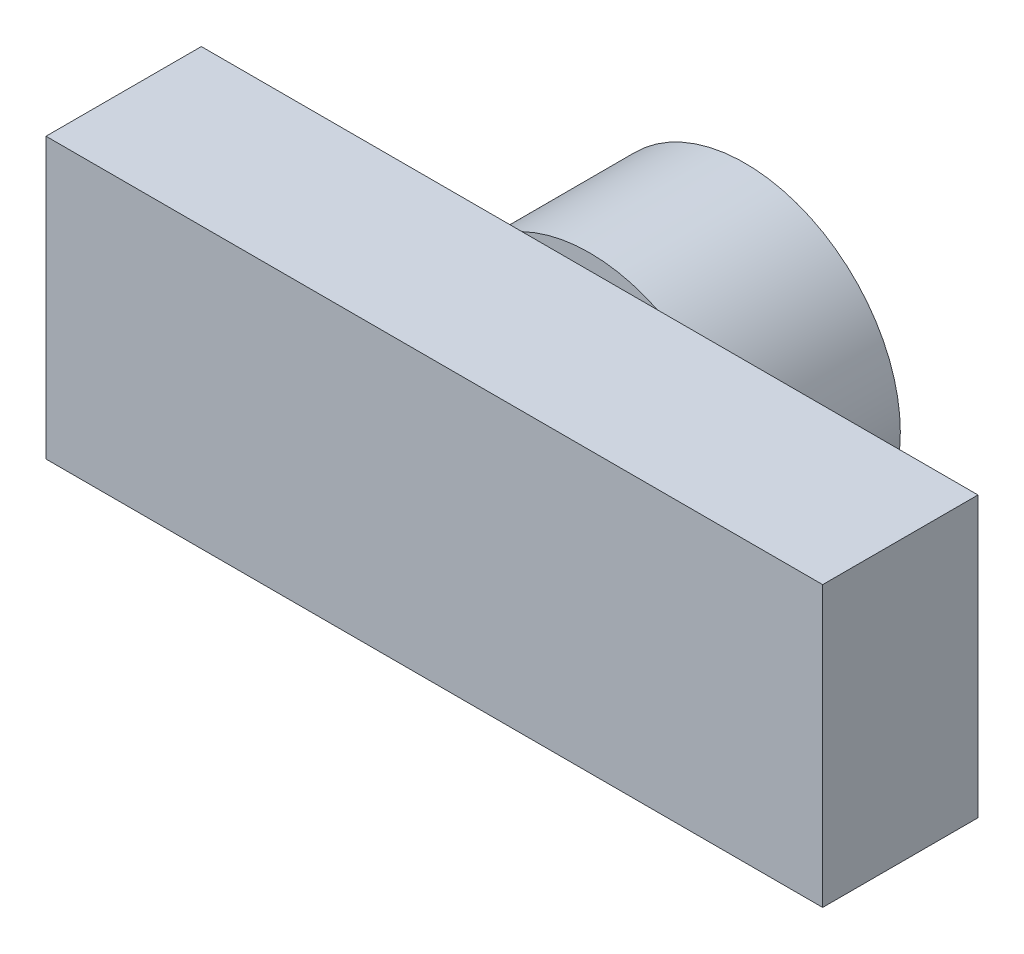
ISO-10303-21;
HEADER;
FILE_DESCRIPTION(('STEP AP214'),'2;1');
FILE_NAME('part.step','',(''),(''),'','','');
FILE_SCHEMA(('AUTOMOTIVE_DESIGN { 1 0 10303 214 1 1 1 1 }'));
ENDSEC;
DATA;
#1=APPLICATION_CONTEXT('core data for automotive mechanical design processes');
#2=APPLICATION_PROTOCOL_DEFINITION('international standard','automotive_design',2000,#1);
#3=PRODUCT_CONTEXT('',#1,'mechanical');
#4=PRODUCT('Part','Part','',(#3));
#5=PRODUCT_RELATED_PRODUCT_CATEGORY('part','',(#4));
#6=PRODUCT_DEFINITION_FORMATION('','',#4);
#7=PRODUCT_DEFINITION_CONTEXT('part definition',#1,'design');
#8=PRODUCT_DEFINITION('design','',#6,#7);
#9=PRODUCT_DEFINITION_SHAPE('','',#8);
#10=(LENGTH_UNIT() NAMED_UNIT(*) SI_UNIT(.MILLI.,.METRE.));
#11=(NAMED_UNIT(*) PLANE_ANGLE_UNIT() SI_UNIT($,.RADIAN.));
#12=(NAMED_UNIT(*) SI_UNIT($,.STERADIAN.) SOLID_ANGLE_UNIT());
#13=UNCERTAINTY_MEASURE_WITH_UNIT(LENGTH_MEASURE(1.E-05),#10,'distance_accuracy_value','');
#14=(GEOMETRIC_REPRESENTATION_CONTEXT(3) GLOBAL_UNCERTAINTY_ASSIGNED_CONTEXT((#13)) GLOBAL_UNIT_ASSIGNED_CONTEXT((#10,
#11,#12)) REPRESENTATION_CONTEXT('',''));
#15=CARTESIAN_POINT('',(0.,0.,0.));
#16=DIRECTION('',(0.,0.,1.));
#17=DIRECTION('',(1.,0.,0.));
#18=AXIS2_PLACEMENT_3D('',#15,#16,#17);
#19=CARTESIAN_POINT('',(0.,0.,5.));
#20=DIRECTION('',(0.,0.,1.));
#21=DIRECTION('',(1.,0.,0.));
#22=AXIS2_PLACEMENT_3D('',#19,#20,#21);
#23=PLANE('',#22);
#24=DIRECTION('',(1.,0.,0.));
#25=VECTOR('',#24,1.);
#26=CARTESIAN_POINT('',(-12.5,-4.5,5.));
#27=LINE('',#26,#25);
#28=CARTESIAN_POINT('',(-2.17944947177034,-4.5,5.));
#29=VERTEX_POINT('',#28);
#30=CARTESIAN_POINT('',(2.17944947177034,-4.5,5.));
#31=VERTEX_POINT('',#30);
#32=EDGE_CURVE('E11',#29,#31,#27,.T.);
#33=ORIENTED_EDGE('',*,*,#32,.F.);
#34=CARTESIAN_POINT('',(0.,0.,5.));
#35=DIRECTION('',(0.,0.,1.));
#36=DIRECTION('',(1.,0.,0.));
#37=AXIS2_PLACEMENT_3D('',#34,#35,#36);
#38=CIRCLE('',#37,5.);
#39=EDGE_CURVE('E143',#29,#31,#38,.T.);
#40=ORIENTED_EDGE('',*,*,#39,.T.);
#41=EDGE_LOOP('',(#33,#40));
#42=FACE_BOUND('',#41,.T.);
#43=ADVANCED_FACE('F39',(#42),#23,.T.);
#44=CARTESIAN_POINT('',(0.,0.,5.));
#45=DIRECTION('',(0.,0.,-1.));
#46=DIRECTION('',(-1.,0.,0.));
#47=AXIS2_PLACEMENT_3D('',#44,#45,#46);
#48=CYLINDRICAL_SURFACE('',#47,5.);
#49=CARTESIAN_POINT('',(2.17944947177034,4.5,5.));
#50=VERTEX_POINT('',#49);
#51=CARTESIAN_POINT('',(-2.17944947177034,4.5,5.));
#52=VERTEX_POINT('',#51);
#53=EDGE_CURVE('E131',#50,#52,#38,.T.);
#54=ORIENTED_EDGE('',*,*,#53,.F.);
#55=EDGE_CURVE('E59',#31,#50,#38,.T.);
#56=ORIENTED_EDGE('',*,*,#55,.F.);
#57=ORIENTED_EDGE('',*,*,#39,.F.);
#58=EDGE_CURVE('E133',#52,#29,#38,.T.);
#59=ORIENTED_EDGE('',*,*,#58,.F.);
#60=EDGE_LOOP('',(#54,#56,#57,#59));
#61=FACE_BOUND('',#60,.T.);
#62=CARTESIAN_POINT('',(0.,0.,0.));
#63=DIRECTION('',(0.,0.,1.));
#64=DIRECTION('',(1.,0.,0.));
#65=AXIS2_PLACEMENT_3D('',#62,#63,#64);
#66=CIRCLE('',#65,5.);
#67=CARTESIAN_POINT('',(5.,0.,0.));
#68=VERTEX_POINT('',#67);
#69=EDGE_CURVE('E43',#68,#68,#66,.T.);
#70=ORIENTED_EDGE('',*,*,#69,.T.);
#71=EDGE_LOOP('',(#70));
#72=FACE_BOUND('',#71,.T.);
#73=ADVANCED_FACE('F41',(#61,#72),#48,.T.);
#74=DIRECTION('',(-1.,0.,0.));
#75=VECTOR('',#74,1.);
#76=CARTESIAN_POINT('',(-12.5,4.5,5.));
#77=LINE('',#76,#75);
#78=EDGE_CURVE('E49',#50,#52,#77,.T.);
#79=ORIENTED_EDGE('',*,*,#78,.F.);
#80=ORIENTED_EDGE('',*,*,#53,.T.);
#81=EDGE_LOOP('',(#79,#80));
#82=FACE_BOUND('',#81,.T.);
#83=ADVANCED_FACE('F186',(#82),#23,.T.);
#84=CARTESIAN_POINT('',(0.,0.,0.));
#85=DIRECTION('',(0.,0.,1.));
#86=DIRECTION('',(1.,0.,0.));
#87=AXIS2_PLACEMENT_3D('',#84,#85,#86);
#88=PLANE('',#87);
#89=ORIENTED_EDGE('',*,*,#69,.F.);
#90=EDGE_LOOP('',(#89));
#91=FACE_BOUND('',#90,.T.);
#92=ADVANCED_FACE('F179',(#91),#88,.F.);
#93=CARTESIAN_POINT('',(0.,0.,5.));
#94=DIRECTION('',(0.,0.,-1.));
#95=DIRECTION('',(-1.,0.,0.));
#96=AXIS2_PLACEMENT_3D('',#93,#94,#95);
#97=PLANE('',#96);
#98=CARTESIAN_POINT('',(-12.5,4.5,5.));
#99=VERTEX_POINT('',#98);
#100=EDGE_CURVE('E141',#52,#99,#77,.T.);
#101=ORIENTED_EDGE('',*,*,#100,.F.);
#102=ORIENTED_EDGE('',*,*,#58,.T.);
#103=CARTESIAN_POINT('',(-12.5,-4.5,5.));
#104=VERTEX_POINT('',#103);
#105=EDGE_CURVE('E51',#104,#29,#27,.T.);
#106=ORIENTED_EDGE('',*,*,#105,.F.);
#107=DIRECTION('',(0.,-1.,0.));
#108=VECTOR('',#107,1.);
#109=CARTESIAN_POINT('',(-12.5,-4.5,5.));
#110=LINE('',#109,#108);
#111=EDGE_CURVE('E151',#99,#104,#110,.T.);
#112=ORIENTED_EDGE('',*,*,#111,.F.);
#113=EDGE_LOOP('',(#101,#102,#106,#112));
#114=FACE_BOUND('',#113,.T.);
#115=ADVANCED_FACE('F177',(#114),#97,.T.);
#116=CARTESIAN_POINT('',(12.5,-4.5,10.));
#117=DIRECTION('',(-1.,0.,0.));
#118=DIRECTION('',(0.,0.,1.));
#119=AXIS2_PLACEMENT_3D('',#116,#117,#118);
#120=PLANE('',#119);
#121=DIRECTION('',(0.,1.,0.));
#122=VECTOR('',#121,1.);
#123=CARTESIAN_POINT('',(12.5,-4.5,5.));
#124=LINE('',#123,#122);
#125=CARTESIAN_POINT('',(12.5,-4.5,5.));
#126=VERTEX_POINT('',#125);
#127=CARTESIAN_POINT('',(12.5,4.5,5.));
#128=VERTEX_POINT('',#127);
#129=EDGE_CURVE('E122',#126,#128,#124,.T.);
#130=ORIENTED_EDGE('',*,*,#129,.T.);
#131=DIRECTION('',(0.,0.,-1.));
#132=VECTOR('',#131,1.);
#133=CARTESIAN_POINT('',(12.5,4.5,10.));
#134=LINE('',#133,#132);
#135=CARTESIAN_POINT('',(12.5,4.5,10.));
#136=VERTEX_POINT('',#135);
#137=EDGE_CURVE('E101',#136,#128,#134,.T.);
#138=ORIENTED_EDGE('',*,*,#137,.F.);
#139=DIRECTION('',(0.,1.,0.));
#140=VECTOR('',#139,1.);
#141=CARTESIAN_POINT('',(12.5,-4.5,10.));
#142=LINE('',#141,#140);
#143=CARTESIAN_POINT('',(12.5,-4.5,10.));
#144=VERTEX_POINT('',#143);
#145=EDGE_CURVE('E109',#144,#136,#142,.T.);
#146=ORIENTED_EDGE('',*,*,#145,.F.);
#147=DIRECTION('',(0.,0.,-1.));
#148=VECTOR('',#147,1.);
#149=CARTESIAN_POINT('',(12.5,-4.5,10.));
#150=LINE('',#149,#148);
#151=EDGE_CURVE('E162',#144,#126,#150,.T.);
#152=ORIENTED_EDGE('',*,*,#151,.T.);
#153=EDGE_LOOP('',(#130,#138,#146,#152));
#154=FACE_BOUND('',#153,.T.);
#155=ADVANCED_FACE('F120',(#154),#120,.F.);
#156=CARTESIAN_POINT('',(-12.5,4.5,10.));
#157=DIRECTION('',(0.,-1.,0.));
#158=DIRECTION('',(0.,0.,-1.));
#159=AXIS2_PLACEMENT_3D('',#156,#157,#158);
#160=PLANE('',#159);
#161=EDGE_CURVE('E140',#128,#50,#77,.T.);
#162=ORIENTED_EDGE('',*,*,#161,.T.);
#163=ORIENTED_EDGE('',*,*,#78,.T.);
#164=ORIENTED_EDGE('',*,*,#100,.T.);
#165=DIRECTION('',(0.,0.,-1.));
#166=VECTOR('',#165,1.);
#167=CARTESIAN_POINT('',(-12.5,4.5,10.));
#168=LINE('',#167,#166);
#169=CARTESIAN_POINT('',(-12.5,4.5,10.));
#170=VERTEX_POINT('',#169);
#171=EDGE_CURVE('E104',#170,#99,#168,.T.);
#172=ORIENTED_EDGE('',*,*,#171,.F.);
#173=DIRECTION('',(-1.,0.,0.));
#174=VECTOR('',#173,1.);
#175=CARTESIAN_POINT('',(-12.5,4.5,10.));
#176=LINE('',#175,#174);
#177=EDGE_CURVE('E96',#136,#170,#176,.T.);
#178=ORIENTED_EDGE('',*,*,#177,.F.);
#179=ORIENTED_EDGE('',*,*,#137,.T.);
#180=EDGE_LOOP('',(#162,#163,#164,#172,#178,#179));
#181=FACE_BOUND('',#180,.T.);
#182=ADVANCED_FACE('F99',(#181),#160,.F.);
#183=CARTESIAN_POINT('',(-12.5,-4.5,10.));
#184=DIRECTION('',(1.,0.,0.));
#185=DIRECTION('',(0.,0.,-1.));
#186=AXIS2_PLACEMENT_3D('',#183,#184,#185);
#187=PLANE('',#186);
#188=ORIENTED_EDGE('',*,*,#111,.T.);
#189=DIRECTION('',(0.,0.,-1.));
#190=VECTOR('',#189,1.);
#191=CARTESIAN_POINT('',(-12.5,-4.5,10.));
#192=LINE('',#191,#190);
#193=CARTESIAN_POINT('',(-12.5,-4.5,10.));
#194=VERTEX_POINT('',#193);
#195=EDGE_CURVE('E128',#194,#104,#192,.T.);
#196=ORIENTED_EDGE('',*,*,#195,.F.);
#197=DIRECTION('',(0.,-1.,0.));
#198=VECTOR('',#197,1.);
#199=CARTESIAN_POINT('',(-12.5,-4.5,10.));
#200=LINE('',#199,#198);
#201=EDGE_CURVE('E108',#170,#194,#200,.T.);
#202=ORIENTED_EDGE('',*,*,#201,.F.);
#203=ORIENTED_EDGE('',*,*,#171,.T.);
#204=EDGE_LOOP('',(#188,#196,#202,#203));
#205=FACE_BOUND('',#204,.T.);
#206=ADVANCED_FACE('F176',(#205),#187,.F.);
#207=CARTESIAN_POINT('',(-12.5,-4.5,10.));
#208=DIRECTION('',(0.,1.,0.));
#209=DIRECTION('',(0.,0.,1.));
#210=AXIS2_PLACEMENT_3D('',#207,#208,#209);
#211=PLANE('',#210);
#212=ORIENTED_EDGE('',*,*,#105,.T.);
#213=ORIENTED_EDGE('',*,*,#32,.T.);
#214=EDGE_CURVE('E52',#31,#126,#27,.T.);
#215=ORIENTED_EDGE('',*,*,#214,.T.);
#216=ORIENTED_EDGE('',*,*,#151,.F.);
#217=DIRECTION('',(1.,0.,0.));
#218=VECTOR('',#217,1.);
#219=CARTESIAN_POINT('',(-12.5,-4.5,10.));
#220=LINE('',#219,#218);
#221=EDGE_CURVE('E114',#194,#144,#220,.T.);
#222=ORIENTED_EDGE('',*,*,#221,.F.);
#223=ORIENTED_EDGE('',*,*,#195,.T.);
#224=EDGE_LOOP('',(#212,#213,#215,#216,#222,#223));
#225=FACE_BOUND('',#224,.T.);
#226=ADVANCED_FACE('F153',(#225),#211,.F.);
#227=CARTESIAN_POINT('',(0.,0.,10.));
#228=DIRECTION('',(0.,0.,-1.));
#229=DIRECTION('',(-1.,0.,0.));
#230=AXIS2_PLACEMENT_3D('',#227,#228,#229);
#231=PLANE('',#230);
#232=ORIENTED_EDGE('',*,*,#145,.T.);
#233=ORIENTED_EDGE('',*,*,#177,.T.);
#234=ORIENTED_EDGE('',*,*,#201,.T.);
#235=ORIENTED_EDGE('',*,*,#221,.T.);
#236=EDGE_LOOP('',(#232,#233,#234,#235));
#237=FACE_BOUND('',#236,.T.);
#238=ADVANCED_FACE('F112',(#237),#231,.F.);
#239=ORIENTED_EDGE('',*,*,#214,.F.);
#240=ORIENTED_EDGE('',*,*,#55,.T.);
#241=ORIENTED_EDGE('',*,*,#161,.F.);
#242=ORIENTED_EDGE('',*,*,#129,.F.);
#243=EDGE_LOOP('',(#239,#240,#241,#242));
#244=FACE_BOUND('',#243,.T.);
#245=ADVANCED_FACE('F148',(#244),#97,.T.);
#246=CLOSED_SHELL('',(#43,#73,#83,#92,#115,#155,#182,#206,#226,#238,#245));
#247=MANIFOLD_SOLID_BREP('B2',#246);
#248=ADVANCED_BREP_SHAPE_REPRESENTATION('',(#18,#247),#14);
#249=SHAPE_DEFINITION_REPRESENTATION(#9,#248);
ENDSEC;
END-ISO-10303-21;
